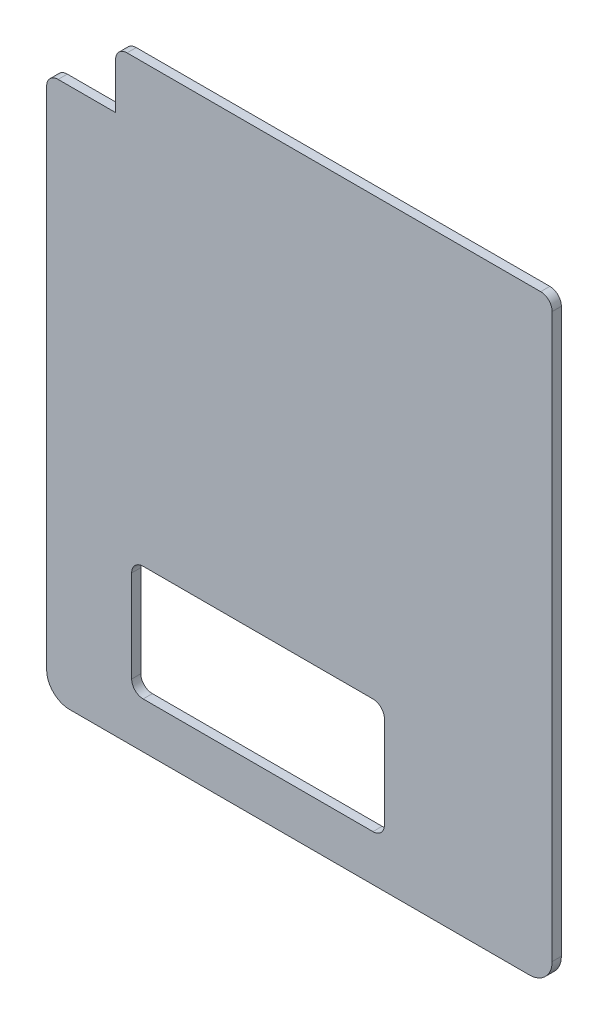
ISO-10303-21;
HEADER;
FILE_DESCRIPTION(('STEP AP214'),'2;1');
FILE_NAME('part.step','',(''),(''),'','','');
FILE_SCHEMA(('AUTOMOTIVE_DESIGN { 1 0 10303 214 1 1 1 1 }'));
ENDSEC;
DATA;
#1=APPLICATION_CONTEXT('core data for automotive mechanical design processes');
#2=APPLICATION_PROTOCOL_DEFINITION('international standard','automotive_design',2000,#1);
#3=PRODUCT_CONTEXT('',#1,'mechanical');
#4=PRODUCT('Part','Part','',(#3));
#5=PRODUCT_RELATED_PRODUCT_CATEGORY('part','',(#4));
#6=PRODUCT_DEFINITION_FORMATION('','',#4);
#7=PRODUCT_DEFINITION_CONTEXT('part definition',#1,'design');
#8=PRODUCT_DEFINITION('design','',#6,#7);
#9=PRODUCT_DEFINITION_SHAPE('','',#8);
#10=(LENGTH_UNIT() NAMED_UNIT(*) SI_UNIT(.MILLI.,.METRE.));
#11=(NAMED_UNIT(*) PLANE_ANGLE_UNIT() SI_UNIT($,.RADIAN.));
#12=(NAMED_UNIT(*) SI_UNIT($,.STERADIAN.) SOLID_ANGLE_UNIT());
#13=UNCERTAINTY_MEASURE_WITH_UNIT(LENGTH_MEASURE(1.E-05),#10,'distance_accuracy_value','');
#14=(GEOMETRIC_REPRESENTATION_CONTEXT(3) GLOBAL_UNCERTAINTY_ASSIGNED_CONTEXT((#13)) GLOBAL_UNIT_ASSIGNED_CONTEXT((#10,
#11,#12)) REPRESENTATION_CONTEXT('',''));
#15=CARTESIAN_POINT('',(0.,0.,0.));
#16=DIRECTION('',(0.,0.,1.));
#17=DIRECTION('',(1.,0.,0.));
#18=AXIS2_PLACEMENT_3D('',#15,#16,#17);
#19=CARTESIAN_POINT('',(0.,0.,0.4));
#20=DIRECTION('',(0.,0.,1.));
#21=DIRECTION('',(1.,0.,0.));
#22=AXIS2_PLACEMENT_3D('',#19,#20,#21);
#23=PLANE('',#22);
#24=DIRECTION('',(1.,0.,0.));
#25=VECTOR('',#24,1.);
#26=CARTESIAN_POINT('',(-22.,-26.,0.4));
#27=LINE('',#26,#25);
#28=CARTESIAN_POINT('',(-21.,-26.,0.4));
#29=VERTEX_POINT('',#28);
#30=CARTESIAN_POINT('',(-1.,-26.,0.4));
#31=VERTEX_POINT('',#30);
#32=EDGE_CURVE('E195',#29,#31,#27,.T.);
#33=ORIENTED_EDGE('',*,*,#32,.T.);
#34=CARTESIAN_POINT('',(-1.,-25.,0.4));
#35=DIRECTION('',(0.,0.,1.));
#36=DIRECTION('',(1.,0.,0.));
#37=AXIS2_PLACEMENT_3D('',#34,#35,#36);
#38=CIRCLE('',#37,1.);
#39=CARTESIAN_POINT('',(0.,-25.,0.4));
#40=VERTEX_POINT('',#39);
#41=EDGE_CURVE('E47',#31,#40,#38,.T.);
#42=ORIENTED_EDGE('',*,*,#41,.T.);
#43=DIRECTION('',(0.,1.,0.));
#44=VECTOR('',#43,1.);
#45=CARTESIAN_POINT('',(0.,-26.,0.4));
#46=LINE('',#45,#44);
#47=CARTESIAN_POINT('',(0.,-0.500000000000007,0.4));
#48=VERTEX_POINT('',#47);
#49=EDGE_CURVE('E218',#40,#48,#46,.T.);
#50=ORIENTED_EDGE('',*,*,#49,.T.);
#51=CARTESIAN_POINT('',(-0.5,-0.5,0.4));
#52=DIRECTION('',(0.,0.,1.));
#53=DIRECTION('',(1.,0.,0.));
#54=AXIS2_PLACEMENT_3D('',#51,#52,#53);
#55=CIRCLE('',#54,0.5);
#56=CARTESIAN_POINT('',(-0.5,0.,0.4));
#57=VERTEX_POINT('',#56);
#58=EDGE_CURVE('E252',#48,#57,#55,.T.);
#59=ORIENTED_EDGE('',*,*,#58,.T.);
#60=DIRECTION('',(-1.,0.,0.));
#61=VECTOR('',#60,1.);
#62=CARTESIAN_POINT('',(0.,0.,0.4));
#63=LINE('',#62,#61);
#64=CARTESIAN_POINT('',(-18.5,0.,0.4));
#65=VERTEX_POINT('',#64);
#66=EDGE_CURVE('E184',#57,#65,#63,.T.);
#67=ORIENTED_EDGE('',*,*,#66,.T.);
#68=CARTESIAN_POINT('',(-18.5,-0.500000000000002,0.4));
#69=DIRECTION('',(0.,0.,1.));
#70=DIRECTION('',(1.,0.,0.));
#71=AXIS2_PLACEMENT_3D('',#68,#69,#70);
#72=CIRCLE('',#71,0.5);
#73=CARTESIAN_POINT('',(-19.,-0.500000000000002,0.4));
#74=VERTEX_POINT('',#73);
#75=EDGE_CURVE('E180',#65,#74,#72,.T.);
#76=ORIENTED_EDGE('',*,*,#75,.T.);
#77=DIRECTION('',(0.,-1.,0.));
#78=VECTOR('',#77,1.);
#79=CARTESIAN_POINT('',(-19.,0.,0.4));
#80=LINE('',#79,#78);
#81=CARTESIAN_POINT('',(-19.,-2.5,0.4));
#82=VERTEX_POINT('',#81);
#83=EDGE_CURVE('E172',#74,#82,#80,.T.);
#84=ORIENTED_EDGE('',*,*,#83,.T.);
#85=DIRECTION('',(-1.,0.,0.));
#86=VECTOR('',#85,1.);
#87=CARTESIAN_POINT('',(-19.,-2.5,0.4));
#88=LINE('',#87,#86);
#89=CARTESIAN_POINT('',(-21.5,-2.5,0.4));
#90=VERTEX_POINT('',#89);
#91=EDGE_CURVE('E176',#82,#90,#88,.T.);
#92=ORIENTED_EDGE('',*,*,#91,.T.);
#93=CARTESIAN_POINT('',(-21.5,-3.,0.4));
#94=DIRECTION('',(0.,0.,1.));
#95=DIRECTION('',(1.,0.,0.));
#96=AXIS2_PLACEMENT_3D('',#93,#94,#95);
#97=CIRCLE('',#96,0.5);
#98=CARTESIAN_POINT('',(-22.,-3.,0.4));
#99=VERTEX_POINT('',#98);
#100=EDGE_CURVE('E250',#90,#99,#97,.T.);
#101=ORIENTED_EDGE('',*,*,#100,.T.);
#102=DIRECTION('',(0.,-1.,0.));
#103=VECTOR('',#102,1.);
#104=CARTESIAN_POINT('',(-22.,-2.5,0.4));
#105=LINE('',#104,#103);
#106=CARTESIAN_POINT('',(-22.,-25.,0.4));
#107=VERTEX_POINT('',#106);
#108=EDGE_CURVE('E200',#99,#107,#105,.T.);
#109=ORIENTED_EDGE('',*,*,#108,.T.);
#110=CARTESIAN_POINT('',(-21.,-25.,0.4));
#111=DIRECTION('',(0.,0.,1.));
#112=DIRECTION('',(1.,0.,0.));
#113=AXIS2_PLACEMENT_3D('',#110,#111,#112);
#114=CIRCLE('',#113,1.);
#115=EDGE_CURVE('E292',#107,#29,#114,.T.);
#116=ORIENTED_EDGE('',*,*,#115,.T.);
#117=EDGE_LOOP('',(#33,#42,#50,#59,#67,#76,#84,#92,#101,#109,#116));
#118=FACE_BOUND('',#117,.T.);
#119=DIRECTION('',(1.,0.,0.));
#120=VECTOR('',#119,1.);
#121=CARTESIAN_POINT('',(-18.3,-24.,0.4));
#122=LINE('',#121,#120);
#123=CARTESIAN_POINT('',(-17.8,-24.,0.4));
#124=VERTEX_POINT('',#123);
#125=CARTESIAN_POINT('',(-7.8,-24.,0.4));
#126=VERTEX_POINT('',#125);
#127=EDGE_CURVE('E394',#124,#126,#122,.T.);
#128=ORIENTED_EDGE('',*,*,#127,.F.);
#129=CARTESIAN_POINT('',(-17.8,-23.5,0.4));
#130=DIRECTION('',(0.,0.,1.));
#131=DIRECTION('',(1.,0.,0.));
#132=AXIS2_PLACEMENT_3D('',#129,#130,#131);
#133=CIRCLE('',#132,0.5);
#134=CARTESIAN_POINT('',(-18.3,-23.5,0.4));
#135=VERTEX_POINT('',#134);
#136=EDGE_CURVE('E267',#124,#135,#133,.F.);
#137=ORIENTED_EDGE('',*,*,#136,.T.);
#138=DIRECTION('',(0.,-1.,0.));
#139=VECTOR('',#138,1.);
#140=CARTESIAN_POINT('',(-18.3,-24.,0.4));
#141=LINE('',#140,#139);
#142=CARTESIAN_POINT('',(-18.3,-19.5,0.4));
#143=VERTEX_POINT('',#142);
#144=EDGE_CURVE('E379',#143,#135,#141,.T.);
#145=ORIENTED_EDGE('',*,*,#144,.F.);
#146=CARTESIAN_POINT('',(-17.8,-19.5,0.4));
#147=DIRECTION('',(0.,0.,1.));
#148=DIRECTION('',(1.,0.,0.));
#149=AXIS2_PLACEMENT_3D('',#146,#147,#148);
#150=CIRCLE('',#149,0.5);
#151=CARTESIAN_POINT('',(-17.8,-19.,0.4));
#152=VERTEX_POINT('',#151);
#153=EDGE_CURVE('E279',#143,#152,#150,.F.);
#154=ORIENTED_EDGE('',*,*,#153,.T.);
#155=DIRECTION('',(-1.,0.,0.));
#156=VECTOR('',#155,1.);
#157=CARTESIAN_POINT('',(-18.3,-19.,0.4));
#158=LINE('',#157,#156);
#159=CARTESIAN_POINT('',(-7.8,-19.,0.4));
#160=VERTEX_POINT('',#159);
#161=EDGE_CURVE('E209',#160,#152,#158,.T.);
#162=ORIENTED_EDGE('',*,*,#161,.F.);
#163=CARTESIAN_POINT('',(-7.8,-19.5,0.4));
#164=DIRECTION('',(0.,0.,1.));
#165=DIRECTION('',(1.,0.,0.));
#166=AXIS2_PLACEMENT_3D('',#163,#164,#165);
#167=CIRCLE('',#166,0.5);
#168=CARTESIAN_POINT('',(-7.3,-19.5,0.4));
#169=VERTEX_POINT('',#168);
#170=EDGE_CURVE('E275',#160,#169,#167,.F.);
#171=ORIENTED_EDGE('',*,*,#170,.T.);
#172=DIRECTION('',(0.,1.,0.));
#173=VECTOR('',#172,1.);
#174=CARTESIAN_POINT('',(-7.3,-24.,0.4));
#175=LINE('',#174,#173);
#176=CARTESIAN_POINT('',(-7.3,-23.5,0.4));
#177=VERTEX_POINT('',#176);
#178=EDGE_CURVE('E391',#177,#169,#175,.T.);
#179=ORIENTED_EDGE('',*,*,#178,.F.);
#180=CARTESIAN_POINT('',(-7.8,-23.5,0.4));
#181=DIRECTION('',(0.,0.,1.));
#182=DIRECTION('',(1.,0.,0.));
#183=AXIS2_PLACEMENT_3D('',#180,#181,#182);
#184=CIRCLE('',#183,0.5);
#185=EDGE_CURVE('E271',#177,#126,#184,.F.);
#186=ORIENTED_EDGE('',*,*,#185,.T.);
#187=EDGE_LOOP('',(#128,#137,#145,#154,#162,#171,#179,#186));
#188=FACE_BOUND('',#187,.T.);
#189=ADVANCED_FACE('F39',(#118,#188),#23,.T.);
#190=CARTESIAN_POINT('',(0.,0.,0.));
#191=DIRECTION('',(0.,0.,1.));
#192=DIRECTION('',(1.,0.,0.));
#193=AXIS2_PLACEMENT_3D('',#190,#191,#192);
#194=PLANE('',#193);
#195=DIRECTION('',(0.,1.,0.));
#196=VECTOR('',#195,1.);
#197=CARTESIAN_POINT('',(0.,-26.,0.));
#198=LINE('',#197,#196);
#199=CARTESIAN_POINT('',(0.,-25.,0.));
#200=VERTEX_POINT('',#199);
#201=CARTESIAN_POINT('',(0.,-0.500000000000007,0.));
#202=VERTEX_POINT('',#201);
#203=EDGE_CURVE('E206',#200,#202,#198,.T.);
#204=ORIENTED_EDGE('',*,*,#203,.F.);
#205=CARTESIAN_POINT('',(-1.,-25.,0.));
#206=DIRECTION('',(0.,0.,1.));
#207=DIRECTION('',(1.,0.,0.));
#208=AXIS2_PLACEMENT_3D('',#205,#206,#207);
#209=CIRCLE('',#208,1.);
#210=CARTESIAN_POINT('',(-1.,-26.,0.));
#211=VERTEX_POINT('',#210);
#212=EDGE_CURVE('E286',#200,#211,#209,.F.);
#213=ORIENTED_EDGE('',*,*,#212,.T.);
#214=DIRECTION('',(1.,0.,0.));
#215=VECTOR('',#214,1.);
#216=CARTESIAN_POINT('',(-22.,-26.,0.));
#217=LINE('',#216,#215);
#218=CARTESIAN_POINT('',(-21.,-26.,0.));
#219=VERTEX_POINT('',#218);
#220=EDGE_CURVE('E217',#219,#211,#217,.T.);
#221=ORIENTED_EDGE('',*,*,#220,.F.);
#222=CARTESIAN_POINT('',(-21.,-25.,0.));
#223=DIRECTION('',(0.,0.,1.));
#224=DIRECTION('',(1.,0.,0.));
#225=AXIS2_PLACEMENT_3D('',#222,#223,#224);
#226=CIRCLE('',#225,1.);
#227=CARTESIAN_POINT('',(-22.,-25.,0.));
#228=VERTEX_POINT('',#227);
#229=EDGE_CURVE('E284',#219,#228,#226,.F.);
#230=ORIENTED_EDGE('',*,*,#229,.T.);
#231=DIRECTION('',(0.,-1.,0.));
#232=VECTOR('',#231,1.);
#233=CARTESIAN_POINT('',(-22.,-2.5,0.));
#234=LINE('',#233,#232);
#235=CARTESIAN_POINT('',(-22.,-3.,0.));
#236=VERTEX_POINT('',#235);
#237=EDGE_CURVE('E215',#236,#228,#234,.T.);
#238=ORIENTED_EDGE('',*,*,#237,.F.);
#239=CARTESIAN_POINT('',(-21.5,-3.,0.));
#240=DIRECTION('',(0.,0.,1.));
#241=DIRECTION('',(1.,0.,0.));
#242=AXIS2_PLACEMENT_3D('',#239,#240,#241);
#243=CIRCLE('',#242,0.5);
#244=CARTESIAN_POINT('',(-21.5,-2.5,0.));
#245=VERTEX_POINT('',#244);
#246=EDGE_CURVE('E241',#236,#245,#243,.F.);
#247=ORIENTED_EDGE('',*,*,#246,.T.);
#248=DIRECTION('',(-1.,0.,0.));
#249=VECTOR('',#248,1.);
#250=CARTESIAN_POINT('',(-19.,-2.5,0.));
#251=LINE('',#250,#249);
#252=CARTESIAN_POINT('',(-19.,-2.5,0.));
#253=VERTEX_POINT('',#252);
#254=EDGE_CURVE('E213',#253,#245,#251,.T.);
#255=ORIENTED_EDGE('',*,*,#254,.F.);
#256=DIRECTION('',(0.,-1.,0.));
#257=VECTOR('',#256,1.);
#258=CARTESIAN_POINT('',(-19.,0.,0.));
#259=LINE('',#258,#257);
#260=CARTESIAN_POINT('',(-19.,-0.500000000000002,0.));
#261=VERTEX_POINT('',#260);
#262=EDGE_CURVE('E190',#261,#253,#259,.T.);
#263=ORIENTED_EDGE('',*,*,#262,.F.);
#264=CARTESIAN_POINT('',(-18.5,-0.500000000000002,0.));
#265=DIRECTION('',(0.,0.,1.));
#266=DIRECTION('',(1.,0.,0.));
#267=AXIS2_PLACEMENT_3D('',#264,#265,#266);
#268=CIRCLE('',#267,0.5);
#269=CARTESIAN_POINT('',(-18.5,0.,0.));
#270=VERTEX_POINT('',#269);
#271=EDGE_CURVE('E239',#261,#270,#268,.F.);
#272=ORIENTED_EDGE('',*,*,#271,.T.);
#273=DIRECTION('',(-1.,0.,0.));
#274=VECTOR('',#273,1.);
#275=CARTESIAN_POINT('',(0.,0.,0.));
#276=LINE('',#275,#274);
#277=CARTESIAN_POINT('',(-0.5,0.,0.));
#278=VERTEX_POINT('',#277);
#279=EDGE_CURVE('E208',#278,#270,#276,.T.);
#280=ORIENTED_EDGE('',*,*,#279,.F.);
#281=CARTESIAN_POINT('',(-0.5,-0.5,0.));
#282=DIRECTION('',(0.,0.,1.));
#283=DIRECTION('',(1.,0.,0.));
#284=AXIS2_PLACEMENT_3D('',#281,#282,#283);
#285=CIRCLE('',#284,0.5);
#286=EDGE_CURVE('E243',#278,#202,#285,.F.);
#287=ORIENTED_EDGE('',*,*,#286,.T.);
#288=EDGE_LOOP('',(#204,#213,#221,#230,#238,#247,#255,#263,#272,#280,#287));
#289=FACE_BOUND('',#288,.T.);
#290=DIRECTION('',(-1.,0.,0.));
#291=VECTOR('',#290,1.);
#292=CARTESIAN_POINT('',(-18.3,-19.,0.));
#293=LINE('',#292,#291);
#294=CARTESIAN_POINT('',(-7.8,-19.,0.));
#295=VERTEX_POINT('',#294);
#296=CARTESIAN_POINT('',(-17.8,-19.,0.));
#297=VERTEX_POINT('',#296);
#298=EDGE_CURVE('E376',#295,#297,#293,.T.);
#299=ORIENTED_EDGE('',*,*,#298,.T.);
#300=CARTESIAN_POINT('',(-17.8,-19.5,0.));
#301=DIRECTION('',(0.,0.,1.));
#302=DIRECTION('',(1.,0.,0.));
#303=AXIS2_PLACEMENT_3D('',#300,#301,#302);
#304=CIRCLE('',#303,0.5);
#305=CARTESIAN_POINT('',(-18.3,-19.5,0.));
#306=VERTEX_POINT('',#305);
#307=EDGE_CURVE('E277',#297,#306,#304,.T.);
#308=ORIENTED_EDGE('',*,*,#307,.T.);
#309=DIRECTION('',(0.,-1.,0.));
#310=VECTOR('',#309,1.);
#311=CARTESIAN_POINT('',(-18.3,-24.,0.));
#312=LINE('',#311,#310);
#313=CARTESIAN_POINT('',(-18.3,-23.5,0.));
#314=VERTEX_POINT('',#313);
#315=EDGE_CURVE('E386',#306,#314,#312,.T.);
#316=ORIENTED_EDGE('',*,*,#315,.T.);
#317=CARTESIAN_POINT('',(-17.8,-23.5,0.));
#318=DIRECTION('',(0.,0.,1.));
#319=DIRECTION('',(1.,0.,0.));
#320=AXIS2_PLACEMENT_3D('',#317,#318,#319);
#321=CIRCLE('',#320,0.5);
#322=CARTESIAN_POINT('',(-17.8,-24.,0.));
#323=VERTEX_POINT('',#322);
#324=EDGE_CURVE('E265',#314,#323,#321,.T.);
#325=ORIENTED_EDGE('',*,*,#324,.T.);
#326=DIRECTION('',(1.,0.,0.));
#327=VECTOR('',#326,1.);
#328=CARTESIAN_POINT('',(-18.3,-24.,0.));
#329=LINE('',#328,#327);
#330=CARTESIAN_POINT('',(-7.8,-24.,0.));
#331=VERTEX_POINT('',#330);
#332=EDGE_CURVE('E383',#323,#331,#329,.T.);
#333=ORIENTED_EDGE('',*,*,#332,.T.);
#334=CARTESIAN_POINT('',(-7.8,-23.5,0.));
#335=DIRECTION('',(0.,0.,1.));
#336=DIRECTION('',(1.,0.,0.));
#337=AXIS2_PLACEMENT_3D('',#334,#335,#336);
#338=CIRCLE('',#337,0.5);
#339=CARTESIAN_POINT('',(-7.3,-23.5,0.));
#340=VERTEX_POINT('',#339);
#341=EDGE_CURVE('E269',#331,#340,#338,.T.);
#342=ORIENTED_EDGE('',*,*,#341,.T.);
#343=DIRECTION('',(0.,1.,0.));
#344=VECTOR('',#343,1.);
#345=CARTESIAN_POINT('',(-7.3,-24.,0.));
#346=LINE('',#345,#344);
#347=CARTESIAN_POINT('',(-7.3,-19.5,0.));
#348=VERTEX_POINT('',#347);
#349=EDGE_CURVE('E380',#340,#348,#346,.T.);
#350=ORIENTED_EDGE('',*,*,#349,.T.);
#351=CARTESIAN_POINT('',(-7.8,-19.5,0.));
#352=DIRECTION('',(0.,0.,1.));
#353=DIRECTION('',(1.,0.,0.));
#354=AXIS2_PLACEMENT_3D('',#351,#352,#353);
#355=CIRCLE('',#354,0.5);
#356=EDGE_CURVE('E273',#348,#295,#355,.T.);
#357=ORIENTED_EDGE('',*,*,#356,.T.);
#358=EDGE_LOOP('',(#299,#308,#316,#325,#333,#342,#350,#357));
#359=FACE_BOUND('',#358,.T.);
#360=ADVANCED_FACE('F306',(#289,#359),#194,.F.);
#361=CARTESIAN_POINT('',(0.,-26.,0.4));
#362=DIRECTION('',(-1.,0.,0.));
#363=DIRECTION('',(0.,0.,1.));
#364=AXIS2_PLACEMENT_3D('',#361,#362,#363);
#365=PLANE('',#364);
#366=ORIENTED_EDGE('',*,*,#49,.F.);
#367=DIRECTION('',(0.,0.,-1.));
#368=VECTOR('',#367,1.);
#369=CARTESIAN_POINT('',(0.,-25.,0.4));
#370=LINE('',#369,#368);
#371=EDGE_CURVE('E281',#40,#200,#370,.T.);
#372=ORIENTED_EDGE('',*,*,#371,.T.);
#373=ORIENTED_EDGE('',*,*,#203,.T.);
#374=DIRECTION('',(0.,0.,-1.));
#375=VECTOR('',#374,1.);
#376=CARTESIAN_POINT('',(0.,-0.5,0.4));
#377=LINE('',#376,#375);
#378=EDGE_CURVE('E246',#202,#48,#377,.F.);
#379=ORIENTED_EDGE('',*,*,#378,.T.);
#380=EDGE_LOOP('',(#366,#372,#373,#379));
#381=FACE_BOUND('',#380,.T.);
#382=ADVANCED_FACE('F298',(#381),#365,.F.);
#383=CARTESIAN_POINT('',(0.,0.,0.4));
#384=DIRECTION('',(0.,-1.,0.));
#385=DIRECTION('',(1.,0.,0.));
#386=AXIS2_PLACEMENT_3D('',#383,#384,#385);
#387=PLANE('',#386);
#388=ORIENTED_EDGE('',*,*,#66,.F.);
#389=DIRECTION('',(0.,0.,-1.));
#390=VECTOR('',#389,1.);
#391=CARTESIAN_POINT('',(-0.5,0.,0.4));
#392=LINE('',#391,#390);
#393=EDGE_CURVE('E236',#57,#278,#392,.T.);
#394=ORIENTED_EDGE('',*,*,#393,.T.);
#395=ORIENTED_EDGE('',*,*,#279,.T.);
#396=DIRECTION('',(0.,0.,-1.));
#397=VECTOR('',#396,1.);
#398=CARTESIAN_POINT('',(-18.5,0.,0.4));
#399=LINE('',#398,#397);
#400=EDGE_CURVE('E234',#270,#65,#399,.F.);
#401=ORIENTED_EDGE('',*,*,#400,.T.);
#402=EDGE_LOOP('',(#388,#394,#395,#401));
#403=FACE_BOUND('',#402,.T.);
#404=ADVANCED_FACE('F322',(#403),#387,.F.);
#405=CARTESIAN_POINT('',(-19.,0.,0.4));
#406=DIRECTION('',(1.,0.,0.));
#407=DIRECTION('',(0.,0.,-1.));
#408=AXIS2_PLACEMENT_3D('',#405,#406,#407);
#409=PLANE('',#408);
#410=ORIENTED_EDGE('',*,*,#83,.F.);
#411=DIRECTION('',(0.,0.,-1.));
#412=VECTOR('',#411,1.);
#413=CARTESIAN_POINT('',(-19.,-0.500000000000002,0.4));
#414=LINE('',#413,#412);
#415=EDGE_CURVE('E258',#74,#261,#414,.T.);
#416=ORIENTED_EDGE('',*,*,#415,.T.);
#417=ORIENTED_EDGE('',*,*,#262,.T.);
#418=DIRECTION('',(0.,0.,-1.));
#419=VECTOR('',#418,1.);
#420=CARTESIAN_POINT('',(-19.,-2.5,0.4));
#421=LINE('',#420,#419);
#422=EDGE_CURVE('E187',#82,#253,#421,.T.);
#423=ORIENTED_EDGE('',*,*,#422,.F.);
#424=EDGE_LOOP('',(#410,#416,#417,#423));
#425=FACE_BOUND('',#424,.T.);
#426=ADVANCED_FACE('F188',(#425),#409,.F.);
#427=CARTESIAN_POINT('',(-19.,-2.5,0.4));
#428=DIRECTION('',(0.,-1.,0.));
#429=DIRECTION('',(1.,0.,0.));
#430=AXIS2_PLACEMENT_3D('',#427,#428,#429);
#431=PLANE('',#430);
#432=ORIENTED_EDGE('',*,*,#254,.T.);
#433=DIRECTION('',(0.,0.,-1.));
#434=VECTOR('',#433,1.);
#435=CARTESIAN_POINT('',(-21.5,-2.5,0.4));
#436=LINE('',#435,#434);
#437=EDGE_CURVE('E199',#245,#90,#436,.F.);
#438=ORIENTED_EDGE('',*,*,#437,.T.);
#439=ORIENTED_EDGE('',*,*,#91,.F.);
#440=ORIENTED_EDGE('',*,*,#422,.T.);
#441=EDGE_LOOP('',(#432,#438,#439,#440));
#442=FACE_BOUND('',#441,.T.);
#443=ADVANCED_FACE('F197',(#442),#431,.F.);
#444=CARTESIAN_POINT('',(-22.,-2.5,0.4));
#445=DIRECTION('',(1.,0.,0.));
#446=DIRECTION('',(0.,1.,0.));
#447=AXIS2_PLACEMENT_3D('',#444,#445,#446);
#448=PLANE('',#447);
#449=ORIENTED_EDGE('',*,*,#237,.T.);
#450=DIRECTION('',(0.,0.,-1.));
#451=VECTOR('',#450,1.);
#452=CARTESIAN_POINT('',(-22.,-25.,0.4));
#453=LINE('',#452,#451);
#454=EDGE_CURVE('E11',#228,#107,#453,.F.);
#455=ORIENTED_EDGE('',*,*,#454,.T.);
#456=ORIENTED_EDGE('',*,*,#108,.F.);
#457=DIRECTION('',(0.,0.,-1.));
#458=VECTOR('',#457,1.);
#459=CARTESIAN_POINT('',(-22.,-3.,0.4));
#460=LINE('',#459,#458);
#461=EDGE_CURVE('E254',#99,#236,#460,.T.);
#462=ORIENTED_EDGE('',*,*,#461,.T.);
#463=EDGE_LOOP('',(#449,#455,#456,#462));
#464=FACE_BOUND('',#463,.T.);
#465=ADVANCED_FACE('F313',(#464),#448,.F.);
#466=CARTESIAN_POINT('',(-22.,-26.,0.4));
#467=DIRECTION('',(0.,1.,0.));
#468=DIRECTION('',(0.,0.,1.));
#469=AXIS2_PLACEMENT_3D('',#466,#467,#468);
#470=PLANE('',#469);
#471=ORIENTED_EDGE('',*,*,#220,.T.);
#472=DIRECTION('',(0.,0.,-1.));
#473=VECTOR('',#472,1.);
#474=CARTESIAN_POINT('',(-1.,-26.,0.4));
#475=LINE('',#474,#473);
#476=EDGE_CURVE('E60',#211,#31,#475,.F.);
#477=ORIENTED_EDGE('',*,*,#476,.T.);
#478=ORIENTED_EDGE('',*,*,#32,.F.);
#479=DIRECTION('',(0.,0.,-1.));
#480=VECTOR('',#479,1.);
#481=CARTESIAN_POINT('',(-21.,-26.,0.4));
#482=LINE('',#481,#480);
#483=EDGE_CURVE('E288',#29,#219,#482,.T.);
#484=ORIENTED_EDGE('',*,*,#483,.T.);
#485=EDGE_LOOP('',(#471,#477,#478,#484));
#486=FACE_BOUND('',#485,.T.);
#487=ADVANCED_FACE('F308',(#486),#470,.F.);
#488=CARTESIAN_POINT('',(-18.3,-24.,0.4));
#489=DIRECTION('',(1.,0.,0.));
#490=DIRECTION('',(0.,1.,0.));
#491=AXIS2_PLACEMENT_3D('',#488,#489,#490);
#492=PLANE('',#491);
#493=ORIENTED_EDGE('',*,*,#144,.T.);
#494=DIRECTION('',(0.,0.,-1.));
#495=VECTOR('',#494,1.);
#496=CARTESIAN_POINT('',(-18.3,-23.5,0.));
#497=LINE('',#496,#495);
#498=EDGE_CURVE('E221',#135,#314,#497,.T.);
#499=ORIENTED_EDGE('',*,*,#498,.T.);
#500=ORIENTED_EDGE('',*,*,#315,.F.);
#501=DIRECTION('',(0.,0.,-1.));
#502=VECTOR('',#501,1.);
#503=CARTESIAN_POINT('',(-18.3,-19.5,0.4));
#504=LINE('',#503,#502);
#505=EDGE_CURVE('E194',#306,#143,#504,.F.);
#506=ORIENTED_EDGE('',*,*,#505,.T.);
#507=EDGE_LOOP('',(#493,#499,#500,#506));
#508=FACE_BOUND('',#507,.T.);
#509=ADVANCED_FACE('F346',(#508),#492,.T.);
#510=CARTESIAN_POINT('',(-18.3,-24.,0.4));
#511=DIRECTION('',(0.,1.,0.));
#512=DIRECTION('',(0.,0.,1.));
#513=AXIS2_PLACEMENT_3D('',#510,#511,#512);
#514=PLANE('',#513);
#515=ORIENTED_EDGE('',*,*,#332,.F.);
#516=DIRECTION('',(0.,0.,-1.));
#517=VECTOR('',#516,1.);
#518=CARTESIAN_POINT('',(-17.8,-24.,0.4));
#519=LINE('',#518,#517);
#520=EDGE_CURVE('E227',#323,#124,#519,.F.);
#521=ORIENTED_EDGE('',*,*,#520,.T.);
#522=ORIENTED_EDGE('',*,*,#127,.T.);
#523=DIRECTION('',(0.,0.,-1.));
#524=VECTOR('',#523,1.);
#525=CARTESIAN_POINT('',(-7.8,-24.,0.));
#526=LINE('',#525,#524);
#527=EDGE_CURVE('E224',#126,#331,#526,.T.);
#528=ORIENTED_EDGE('',*,*,#527,.T.);
#529=EDGE_LOOP('',(#515,#521,#522,#528));
#530=FACE_BOUND('',#529,.T.);
#531=ADVANCED_FACE('F408',(#530),#514,.T.);
#532=CARTESIAN_POINT('',(-7.3,-24.,0.4));
#533=DIRECTION('',(-1.,0.,0.));
#534=DIRECTION('',(0.,0.,1.));
#535=AXIS2_PLACEMENT_3D('',#532,#533,#534);
#536=PLANE('',#535);
#537=ORIENTED_EDGE('',*,*,#349,.F.);
#538=DIRECTION('',(0.,0.,-1.));
#539=VECTOR('',#538,1.);
#540=CARTESIAN_POINT('',(-7.3,-23.5,0.4));
#541=LINE('',#540,#539);
#542=EDGE_CURVE('E232',#340,#177,#541,.F.);
#543=ORIENTED_EDGE('',*,*,#542,.T.);
#544=ORIENTED_EDGE('',*,*,#178,.T.);
#545=DIRECTION('',(0.,0.,-1.));
#546=VECTOR('',#545,1.);
#547=CARTESIAN_POINT('',(-7.3,-19.5,0.));
#548=LINE('',#547,#546);
#549=EDGE_CURVE('E229',#169,#348,#548,.T.);
#550=ORIENTED_EDGE('',*,*,#549,.T.);
#551=EDGE_LOOP('',(#537,#543,#544,#550));
#552=FACE_BOUND('',#551,.T.);
#553=ADVANCED_FACE('F415',(#552),#536,.T.);
#554=CARTESIAN_POINT('',(-18.3,-19.,0.4));
#555=DIRECTION('',(0.,-1.,0.));
#556=DIRECTION('',(0.,0.,-1.));
#557=AXIS2_PLACEMENT_3D('',#554,#555,#556);
#558=PLANE('',#557);
#559=ORIENTED_EDGE('',*,*,#298,.F.);
#560=DIRECTION('',(0.,0.,-1.));
#561=VECTOR('',#560,1.);
#562=CARTESIAN_POINT('',(-7.8,-19.,0.4));
#563=LINE('',#562,#561);
#564=EDGE_CURVE('E263',#295,#160,#563,.F.);
#565=ORIENTED_EDGE('',*,*,#564,.T.);
#566=ORIENTED_EDGE('',*,*,#161,.T.);
#567=DIRECTION('',(0.,0.,-1.));
#568=VECTOR('',#567,1.);
#569=CARTESIAN_POINT('',(-17.8,-19.,0.));
#570=LINE('',#569,#568);
#571=EDGE_CURVE('E260',#152,#297,#570,.T.);
#572=ORIENTED_EDGE('',*,*,#571,.T.);
#573=EDGE_LOOP('',(#559,#565,#566,#572));
#574=FACE_BOUND('',#573,.T.);
#575=ADVANCED_FACE('F365',(#574),#558,.T.);
#576=CARTESIAN_POINT('',(-17.8,-23.5,0.4));
#577=DIRECTION('',(0.,0.,1.));
#578=DIRECTION('',(1.,0.,0.));
#579=AXIS2_PLACEMENT_3D('',#576,#577,#578);
#580=CYLINDRICAL_SURFACE('',#579,0.5);
#581=ORIENTED_EDGE('',*,*,#136,.F.);
#582=ORIENTED_EDGE('',*,*,#520,.F.);
#583=ORIENTED_EDGE('',*,*,#324,.F.);
#584=ORIENTED_EDGE('',*,*,#498,.F.);
#585=EDGE_LOOP('',(#581,#582,#583,#584));
#586=FACE_BOUND('',#585,.T.);
#587=ADVANCED_FACE('F361',(#586),#580,.F.);
#588=CARTESIAN_POINT('',(-7.8,-23.5,0.4));
#589=DIRECTION('',(0.,0.,1.));
#590=DIRECTION('',(1.,0.,0.));
#591=AXIS2_PLACEMENT_3D('',#588,#589,#590);
#592=CYLINDRICAL_SURFACE('',#591,0.5);
#593=ORIENTED_EDGE('',*,*,#185,.F.);
#594=ORIENTED_EDGE('',*,*,#542,.F.);
#595=ORIENTED_EDGE('',*,*,#341,.F.);
#596=ORIENTED_EDGE('',*,*,#527,.F.);
#597=EDGE_LOOP('',(#593,#594,#595,#596));
#598=FACE_BOUND('',#597,.T.);
#599=ADVANCED_FACE('F364',(#598),#592,.F.);
#600=CARTESIAN_POINT('',(-0.5,-0.5,0.4));
#601=DIRECTION('',(0.,0.,-1.));
#602=DIRECTION('',(-1.,0.,0.));
#603=AXIS2_PLACEMENT_3D('',#600,#601,#602);
#604=CYLINDRICAL_SURFACE('',#603,0.5);
#605=ORIENTED_EDGE('',*,*,#58,.F.);
#606=ORIENTED_EDGE('',*,*,#378,.F.);
#607=ORIENTED_EDGE('',*,*,#286,.F.);
#608=ORIENTED_EDGE('',*,*,#393,.F.);
#609=EDGE_LOOP('',(#605,#606,#607,#608));
#610=FACE_BOUND('',#609,.T.);
#611=ADVANCED_FACE('F336',(#610),#604,.T.);
#612=CARTESIAN_POINT('',(-21.5,-3.,0.4));
#613=DIRECTION('',(0.,0.,-1.));
#614=DIRECTION('',(-1.,0.,0.));
#615=AXIS2_PLACEMENT_3D('',#612,#613,#614);
#616=CYLINDRICAL_SURFACE('',#615,0.5);
#617=ORIENTED_EDGE('',*,*,#100,.F.);
#618=ORIENTED_EDGE('',*,*,#437,.F.);
#619=ORIENTED_EDGE('',*,*,#246,.F.);
#620=ORIENTED_EDGE('',*,*,#461,.F.);
#621=EDGE_LOOP('',(#617,#618,#619,#620));
#622=FACE_BOUND('',#621,.T.);
#623=ADVANCED_FACE('F316',(#622),#616,.T.);
#624=CARTESIAN_POINT('',(-18.5,-0.500000000000002,0.4));
#625=DIRECTION('',(0.,0.,-1.));
#626=DIRECTION('',(-1.,0.,0.));
#627=AXIS2_PLACEMENT_3D('',#624,#625,#626);
#628=CYLINDRICAL_SURFACE('',#627,0.5);
#629=ORIENTED_EDGE('',*,*,#75,.F.);
#630=ORIENTED_EDGE('',*,*,#400,.F.);
#631=ORIENTED_EDGE('',*,*,#271,.F.);
#632=ORIENTED_EDGE('',*,*,#415,.F.);
#633=EDGE_LOOP('',(#629,#630,#631,#632));
#634=FACE_BOUND('',#633,.T.);
#635=ADVANCED_FACE('F324',(#634),#628,.T.);
#636=CARTESIAN_POINT('',(-7.8,-19.5,0.4));
#637=DIRECTION('',(0.,0.,1.));
#638=DIRECTION('',(1.,0.,0.));
#639=AXIS2_PLACEMENT_3D('',#636,#637,#638);
#640=CYLINDRICAL_SURFACE('',#639,0.5);
#641=ORIENTED_EDGE('',*,*,#170,.F.);
#642=ORIENTED_EDGE('',*,*,#564,.F.);
#643=ORIENTED_EDGE('',*,*,#356,.F.);
#644=ORIENTED_EDGE('',*,*,#549,.F.);
#645=EDGE_LOOP('',(#641,#642,#643,#644));
#646=FACE_BOUND('',#645,.T.);
#647=ADVANCED_FACE('F326',(#646),#640,.F.);
#648=CARTESIAN_POINT('',(-17.8,-19.5,0.4));
#649=DIRECTION('',(0.,0.,1.));
#650=DIRECTION('',(1.,0.,0.));
#651=AXIS2_PLACEMENT_3D('',#648,#649,#650);
#652=CYLINDRICAL_SURFACE('',#651,0.5);
#653=ORIENTED_EDGE('',*,*,#153,.F.);
#654=ORIENTED_EDGE('',*,*,#505,.F.);
#655=ORIENTED_EDGE('',*,*,#307,.F.);
#656=ORIENTED_EDGE('',*,*,#571,.F.);
#657=EDGE_LOOP('',(#653,#654,#655,#656));
#658=FACE_BOUND('',#657,.T.);
#659=ADVANCED_FACE('F333',(#658),#652,.F.);
#660=CARTESIAN_POINT('',(-1.,-25.,0.4));
#661=DIRECTION('',(0.,0.,-1.));
#662=DIRECTION('',(-1.,0.,0.));
#663=AXIS2_PLACEMENT_3D('',#660,#661,#662);
#664=CYLINDRICAL_SURFACE('',#663,1.);
#665=ORIENTED_EDGE('',*,*,#41,.F.);
#666=ORIENTED_EDGE('',*,*,#476,.F.);
#667=ORIENTED_EDGE('',*,*,#212,.F.);
#668=ORIENTED_EDGE('',*,*,#371,.F.);
#669=EDGE_LOOP('',(#665,#666,#667,#668));
#670=FACE_BOUND('',#669,.T.);
#671=ADVANCED_FACE('F303',(#670),#664,.T.);
#672=CARTESIAN_POINT('',(-21.,-25.,0.4));
#673=DIRECTION('',(0.,0.,-1.));
#674=DIRECTION('',(-1.,0.,0.));
#675=AXIS2_PLACEMENT_3D('',#672,#673,#674);
#676=CYLINDRICAL_SURFACE('',#675,1.);
#677=ORIENTED_EDGE('',*,*,#115,.F.);
#678=ORIENTED_EDGE('',*,*,#454,.F.);
#679=ORIENTED_EDGE('',*,*,#229,.F.);
#680=ORIENTED_EDGE('',*,*,#483,.F.);
#681=EDGE_LOOP('',(#677,#678,#679,#680));
#682=FACE_BOUND('',#681,.T.);
#683=ADVANCED_FACE('F41',(#682),#676,.T.);
#684=CLOSED_SHELL('',(#189,#360,#382,#404,#426,#443,#465,#487,#509,#531,#553,#575,#587,#599,
#611,#623,#635,#647,#659,#671,#683));
#685=MANIFOLD_SOLID_BREP('B2',#684);
#686=ADVANCED_BREP_SHAPE_REPRESENTATION('',(#18,#685),#14);
#687=SHAPE_DEFINITION_REPRESENTATION(#9,#686);
ENDSEC;
END-ISO-10303-21;
